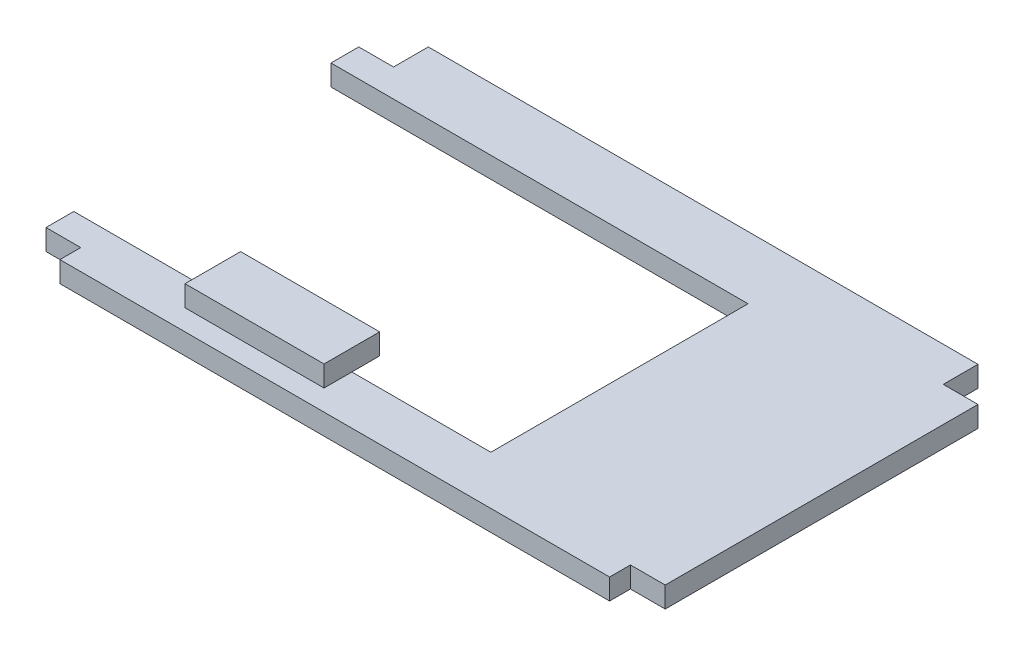
ISO-10303-21;
HEADER;
FILE_DESCRIPTION(('STEP AP214'),'2;1');
FILE_NAME('part.step','',(''),(''),'','','');
FILE_SCHEMA(('AUTOMOTIVE_DESIGN { 1 0 10303 214 1 1 1 1 }'));
ENDSEC;
DATA;
#1=APPLICATION_CONTEXT('core data for automotive mechanical design processes');
#2=APPLICATION_PROTOCOL_DEFINITION('international standard','automotive_design',2000,#1);
#3=PRODUCT_CONTEXT('',#1,'mechanical');
#4=PRODUCT('Part','Part','',(#3));
#5=PRODUCT_RELATED_PRODUCT_CATEGORY('part','',(#4));
#6=PRODUCT_DEFINITION_FORMATION('','',#4);
#7=PRODUCT_DEFINITION_CONTEXT('part definition',#1,'design');
#8=PRODUCT_DEFINITION('design','',#6,#7);
#9=PRODUCT_DEFINITION_SHAPE('','',#8);
#10=(LENGTH_UNIT() NAMED_UNIT(*) SI_UNIT(.MILLI.,.METRE.));
#11=(NAMED_UNIT(*) PLANE_ANGLE_UNIT() SI_UNIT($,.RADIAN.));
#12=(NAMED_UNIT(*) SI_UNIT($,.STERADIAN.) SOLID_ANGLE_UNIT());
#13=UNCERTAINTY_MEASURE_WITH_UNIT(LENGTH_MEASURE(1.E-05),#10,'distance_accuracy_value','');
#14=(GEOMETRIC_REPRESENTATION_CONTEXT(3) GLOBAL_UNCERTAINTY_ASSIGNED_CONTEXT((#13)) GLOBAL_UNIT_ASSIGNED_CONTEXT((#10,
#11,#12)) REPRESENTATION_CONTEXT('',''));
#15=CARTESIAN_POINT('',(0.,0.,0.));
#16=DIRECTION('',(0.,0.,1.));
#17=DIRECTION('',(1.,0.,0.));
#18=AXIS2_PLACEMENT_3D('',#15,#16,#17);
#19=CARTESIAN_POINT('',(75.,0.,0.));
#20=DIRECTION('',(1.,0.,0.));
#21=DIRECTION('',(0.,0.,1.));
#22=AXIS2_PLACEMENT_3D('',#19,#20,#21);
#23=PLANE('',#22);
#24=DIRECTION('',(0.,0.,1.));
#25=VECTOR('',#24,1.);
#26=CARTESIAN_POINT('',(75.,-81.,0.));
#27=LINE('',#26,#25);
#28=CARTESIAN_POINT('',(75.,-81.,41.));
#29=VERTEX_POINT('',#28);
#30=CARTESIAN_POINT('',(75.,-81.,45.));
#31=VERTEX_POINT('',#30);
#32=EDGE_CURVE('E256',#29,#31,#27,.T.);
#33=ORIENTED_EDGE('',*,*,#32,.F.);
#34=DIRECTION('',(0.,-1.,0.));
#35=VECTOR('',#34,1.);
#36=CARTESIAN_POINT('',(75.,0.,41.));
#37=LINE('',#36,#35);
#38=CARTESIAN_POINT('',(75.,-84.,41.));
#39=VERTEX_POINT('',#38);
#40=EDGE_CURVE('E41',#29,#39,#37,.T.);
#41=ORIENTED_EDGE('',*,*,#40,.T.);
#42=DIRECTION('',(0.,0.,-1.));
#43=VECTOR('',#42,1.);
#44=CARTESIAN_POINT('',(75.,-84.,0.));
#45=LINE('',#44,#43);
#46=CARTESIAN_POINT('',(75.,-84.,45.));
#47=VERTEX_POINT('',#46);
#48=EDGE_CURVE('E250',#47,#39,#45,.T.);
#49=ORIENTED_EDGE('',*,*,#48,.F.);
#50=DIRECTION('',(0.,-1.,0.));
#51=VECTOR('',#50,1.);
#52=CARTESIAN_POINT('',(75.,-81.,45.));
#53=LINE('',#52,#51);
#54=EDGE_CURVE('E253',#31,#47,#53,.T.);
#55=ORIENTED_EDGE('',*,*,#54,.F.);
#56=EDGE_LOOP('',(#33,#41,#49,#55));
#57=FACE_BOUND('',#56,.T.);
#58=ADVANCED_FACE('F37',(#57),#23,.F.);
#59=CARTESIAN_POINT('',(80.,-81.,127.141476844526));
#60=DIRECTION('',(1.,0.,0.));
#61=DIRECTION('',(0.,0.,-1.));
#62=AXIS2_PLACEMENT_3D('',#59,#60,#61);
#63=PLANE('',#62);
#64=DIRECTION('',(0.,0.,-1.));
#65=VECTOR('',#64,1.);
#66=CARTESIAN_POINT('',(80.,-84.,127.141476844526));
#67=LINE('',#66,#65);
#68=CARTESIAN_POINT('',(80.,-84.,0.));
#69=VERTEX_POINT('',#68);
#70=CARTESIAN_POINT('',(80.,-84.,-5.));
#71=VERTEX_POINT('',#70);
#72=EDGE_CURVE('E307',#69,#71,#67,.T.);
#73=ORIENTED_EDGE('',*,*,#72,.F.);
#74=DIRECTION('',(0.,1.,0.));
#75=VECTOR('',#74,1.);
#76=CARTESIAN_POINT('',(80.,-81.,0.));
#77=LINE('',#76,#75);
#78=CARTESIAN_POINT('',(80.,-81.,0.));
#79=VERTEX_POINT('',#78);
#80=EDGE_CURVE('E244',#69,#79,#77,.T.);
#81=ORIENTED_EDGE('',*,*,#80,.T.);
#82=DIRECTION('',(0.,0.,-1.));
#83=VECTOR('',#82,1.);
#84=CARTESIAN_POINT('',(80.,-81.,127.141476844526));
#85=LINE('',#84,#83);
#86=CARTESIAN_POINT('',(80.,-81.,-5.));
#87=VERTEX_POINT('',#86);
#88=EDGE_CURVE('E314',#79,#87,#85,.T.);
#89=ORIENTED_EDGE('',*,*,#88,.T.);
#90=DIRECTION('',(0.,1.,0.));
#91=VECTOR('',#90,1.);
#92=CARTESIAN_POINT('',(80.,-81.,-5.));
#93=LINE('',#92,#91);
#94=EDGE_CURVE('E348',#71,#87,#93,.T.);
#95=ORIENTED_EDGE('',*,*,#94,.F.);
#96=EDGE_LOOP('',(#73,#81,#89,#95));
#97=FACE_BOUND('',#96,.T.);
#98=ADVANCED_FACE('F361',(#97),#63,.F.);
#99=CARTESIAN_POINT('',(159.084596206421,-81.,127.141476844526));
#100=DIRECTION('',(-1.,0.,0.));
#101=DIRECTION('',(0.,0.,1.));
#102=AXIS2_PLACEMENT_3D('',#99,#100,#101);
#103=PLANE('',#102);
#104=DIRECTION('',(0.,1.,0.));
#105=VECTOR('',#104,1.);
#106=CARTESIAN_POINT('',(159.084596206421,-81.,0.));
#107=LINE('',#106,#105);
#108=CARTESIAN_POINT('',(159.084596206421,-84.,0.));
#109=VERTEX_POINT('',#108);
#110=CARTESIAN_POINT('',(159.084596206421,-81.,0.));
#111=VERTEX_POINT('',#110);
#112=EDGE_CURVE('E273',#109,#111,#107,.T.);
#113=ORIENTED_EDGE('',*,*,#112,.F.);
#114=DIRECTION('',(0.,0.,-1.));
#115=VECTOR('',#114,1.);
#116=CARTESIAN_POINT('',(159.084596206421,-84.,127.141476844526));
#117=LINE('',#116,#115);
#118=CARTESIAN_POINT('',(159.084596206421,-84.,-5.));
#119=VERTEX_POINT('',#118);
#120=EDGE_CURVE('E313',#109,#119,#117,.T.);
#121=ORIENTED_EDGE('',*,*,#120,.T.);
#122=DIRECTION('',(0.,-1.,0.));
#123=VECTOR('',#122,1.);
#124=CARTESIAN_POINT('',(159.084596206421,-81.,-5.));
#125=LINE('',#124,#123);
#126=CARTESIAN_POINT('',(159.084596206421,-81.,-5.));
#127=VERTEX_POINT('',#126);
#128=EDGE_CURVE('E342',#127,#119,#125,.T.);
#129=ORIENTED_EDGE('',*,*,#128,.F.);
#130=DIRECTION('',(0.,0.,-1.));
#131=VECTOR('',#130,1.);
#132=CARTESIAN_POINT('',(159.084596206421,-81.,127.141476844526));
#133=LINE('',#132,#131);
#134=EDGE_CURVE('E325',#111,#127,#133,.T.);
#135=ORIENTED_EDGE('',*,*,#134,.F.);
#136=EDGE_LOOP('',(#113,#121,#129,#135));
#137=FACE_BOUND('',#136,.T.);
#138=ADVANCED_FACE('F368',(#137),#103,.F.);
#139=DIRECTION('',(0.,-1.,0.));
#140=VECTOR('',#139,1.);
#141=CARTESIAN_POINT('',(159.084596206421,-81.,45.));
#142=LINE('',#141,#140);
#143=CARTESIAN_POINT('',(159.084596206421,-81.,45.));
#144=VERTEX_POINT('',#143);
#145=CARTESIAN_POINT('',(159.084596206421,-84.,45.));
#146=VERTEX_POINT('',#145);
#147=EDGE_CURVE('E330',#144,#146,#142,.T.);
#148=ORIENTED_EDGE('',*,*,#147,.F.);
#149=CARTESIAN_POINT('',(159.084596206421,-81.,48.));
#150=VERTEX_POINT('',#149);
#151=EDGE_CURVE('E300',#150,#144,#133,.T.);
#152=ORIENTED_EDGE('',*,*,#151,.F.);
#153=DIRECTION('',(0.,1.,0.));
#154=VECTOR('',#153,1.);
#155=CARTESIAN_POINT('',(159.084596206421,-81.,48.));
#156=LINE('',#155,#154);
#157=CARTESIAN_POINT('',(159.084596206421,-84.,48.));
#158=VERTEX_POINT('',#157);
#159=EDGE_CURVE('E277',#158,#150,#156,.T.);
#160=ORIENTED_EDGE('',*,*,#159,.F.);
#161=EDGE_CURVE('E322',#158,#146,#117,.T.);
#162=ORIENTED_EDGE('',*,*,#161,.T.);
#163=EDGE_LOOP('',(#148,#152,#160,#162));
#164=FACE_BOUND('',#163,.T.);
#165=ADVANCED_FACE('F403',(#164),#103,.F.);
#166=CARTESIAN_POINT('',(80.,-81.,48.));
#167=VERTEX_POINT('',#166);
#168=CARTESIAN_POINT('',(80.,-81.,45.));
#169=VERTEX_POINT('',#168);
#170=EDGE_CURVE('E317',#167,#169,#85,.T.);
#171=ORIENTED_EDGE('',*,*,#170,.T.);
#172=DIRECTION('',(0.,-1.,0.));
#173=VECTOR('',#172,1.);
#174=CARTESIAN_POINT('',(80.,-81.,45.));
#175=LINE('',#174,#173);
#176=CARTESIAN_POINT('',(80.,-84.,45.));
#177=VERTEX_POINT('',#176);
#178=EDGE_CURVE('E249',#169,#177,#175,.T.);
#179=ORIENTED_EDGE('',*,*,#178,.T.);
#180=CARTESIAN_POINT('',(80.,-84.,48.));
#181=VERTEX_POINT('',#180);
#182=EDGE_CURVE('E310',#181,#177,#67,.T.);
#183=ORIENTED_EDGE('',*,*,#182,.F.);
#184=DIRECTION('',(0.,-1.,0.));
#185=VECTOR('',#184,1.);
#186=CARTESIAN_POINT('',(80.,-81.,48.));
#187=LINE('',#186,#185);
#188=EDGE_CURVE('E289',#167,#181,#187,.T.);
#189=ORIENTED_EDGE('',*,*,#188,.F.);
#190=EDGE_LOOP('',(#171,#179,#183,#189));
#191=FACE_BOUND('',#190,.T.);
#192=ADVANCED_FACE('F409',(#191),#63,.F.);
#193=CARTESIAN_POINT('',(80.,-84.,127.141476844526));
#194=DIRECTION('',(0.,1.,0.));
#195=DIRECTION('',(0.,0.,1.));
#196=AXIS2_PLACEMENT_3D('',#193,#194,#195);
#197=PLANE('',#196);
#198=ORIENTED_EDGE('',*,*,#48,.T.);
#199=DIRECTION('',(1.,0.,0.));
#200=VECTOR('',#199,1.);
#201=CARTESIAN_POINT('',(80.,-84.,41.));
#202=LINE('',#201,#200);
#203=CARTESIAN_POINT('',(135.,-84.,41.));
#204=VERTEX_POINT('',#203);
#205=EDGE_CURVE('E238',#39,#204,#202,.T.);
#206=ORIENTED_EDGE('',*,*,#205,.T.);
#207=DIRECTION('',(0.,0.,-1.));
#208=VECTOR('',#207,1.);
#209=CARTESIAN_POINT('',(135.,-84.,127.141476844526));
#210=LINE('',#209,#208);
#211=CARTESIAN_POINT('',(135.,-84.,4.));
#212=VERTEX_POINT('',#211);
#213=EDGE_CURVE('E241',#204,#212,#210,.T.);
#214=ORIENTED_EDGE('',*,*,#213,.T.);
#215=DIRECTION('',(-1.,0.,0.));
#216=VECTOR('',#215,1.);
#217=CARTESIAN_POINT('',(80.,-84.,4.00000000000002));
#218=LINE('',#217,#216);
#219=CARTESIAN_POINT('',(75.,-84.,4.00000000000001));
#220=VERTEX_POINT('',#219);
#221=EDGE_CURVE('E234',#212,#220,#218,.T.);
#222=ORIENTED_EDGE('',*,*,#221,.T.);
#223=CARTESIAN_POINT('',(75.,-84.,0.));
#224=VERTEX_POINT('',#223);
#225=EDGE_CURVE('E248',#220,#224,#45,.T.);
#226=ORIENTED_EDGE('',*,*,#225,.T.);
#227=DIRECTION('',(1.,0.,0.));
#228=VECTOR('',#227,1.);
#229=CARTESIAN_POINT('',(75.,-84.,0.));
#230=LINE('',#229,#228);
#231=EDGE_CURVE('E271',#224,#69,#230,.T.);
#232=ORIENTED_EDGE('',*,*,#231,.T.);
#233=ORIENTED_EDGE('',*,*,#72,.T.);
#234=DIRECTION('',(-1.,0.,0.));
#235=VECTOR('',#234,1.);
#236=CARTESIAN_POINT('',(80.,-84.,-5.));
#237=LINE('',#236,#235);
#238=EDGE_CURVE('E292',#119,#71,#237,.T.);
#239=ORIENTED_EDGE('',*,*,#238,.F.);
#240=ORIENTED_EDGE('',*,*,#120,.F.);
#241=DIRECTION('',(-1.,0.,0.));
#242=VECTOR('',#241,1.);
#243=CARTESIAN_POINT('',(164.084596206421,-84.,0.));
#244=LINE('',#243,#242);
#245=CARTESIAN_POINT('',(164.084596206421,-84.,0.));
#246=VERTEX_POINT('',#245);
#247=EDGE_CURVE('E374',#246,#109,#244,.T.);
#248=ORIENTED_EDGE('',*,*,#247,.F.);
#249=DIRECTION('',(0.,0.,-1.));
#250=VECTOR('',#249,1.);
#251=CARTESIAN_POINT('',(164.084596206421,-84.,0.));
#252=LINE('',#251,#250);
#253=CARTESIAN_POINT('',(164.084596206421,-84.,45.));
#254=VERTEX_POINT('',#253);
#255=EDGE_CURVE('E380',#254,#246,#252,.T.);
#256=ORIENTED_EDGE('',*,*,#255,.F.);
#257=DIRECTION('',(-1.,0.,0.));
#258=VECTOR('',#257,1.);
#259=CARTESIAN_POINT('',(164.084596206421,-84.,45.));
#260=LINE('',#259,#258);
#261=EDGE_CURVE('E335',#254,#146,#260,.T.);
#262=ORIENTED_EDGE('',*,*,#261,.T.);
#263=ORIENTED_EDGE('',*,*,#161,.F.);
#264=DIRECTION('',(1.,0.,0.));
#265=VECTOR('',#264,1.);
#266=CARTESIAN_POINT('',(80.,-84.,48.));
#267=LINE('',#266,#265);
#268=EDGE_CURVE('E283',#181,#158,#267,.T.);
#269=ORIENTED_EDGE('',*,*,#268,.F.);
#270=ORIENTED_EDGE('',*,*,#182,.T.);
#271=DIRECTION('',(1.,0.,0.));
#272=VECTOR('',#271,1.);
#273=CARTESIAN_POINT('',(75.,-84.,45.));
#274=LINE('',#273,#272);
#275=EDGE_CURVE('E274',#47,#177,#274,.T.);
#276=ORIENTED_EDGE('',*,*,#275,.F.);
#277=EDGE_LOOP('',(#198,#206,#214,#222,#226,#232,#233,#239,#240,#248,#256,#262,#263,#269,#270,#276));
#278=FACE_BOUND('',#277,.T.);
#279=ADVANCED_FACE('F372',(#278),#197,.F.);
#280=CARTESIAN_POINT('',(80.,-81.,127.141476844526));
#281=DIRECTION('',(0.,-1.,0.));
#282=DIRECTION('',(0.,0.,-1.));
#283=AXIS2_PLACEMENT_3D('',#280,#281,#282);
#284=PLANE('',#283);
#285=DIRECTION('',(-1.,0.,0.));
#286=VECTOR('',#285,1.);
#287=CARTESIAN_POINT('',(95.,-81.,45.));
#288=LINE('',#287,#286);
#289=CARTESIAN_POINT('',(115.,-81.,45.));
#290=VERTEX_POINT('',#289);
#291=CARTESIAN_POINT('',(95.,-81.,45.));
#292=VERTEX_POINT('',#291);
#293=EDGE_CURVE('E206',#290,#292,#288,.T.);
#294=ORIENTED_EDGE('',*,*,#293,.T.);
#295=DIRECTION('',(0.,0.,-1.));
#296=VECTOR('',#295,1.);
#297=CARTESIAN_POINT('',(95.,-81.,37.));
#298=LINE('',#297,#296);
#299=CARTESIAN_POINT('',(95.,-81.,41.));
#300=VERTEX_POINT('',#299);
#301=EDGE_CURVE('E54',#292,#300,#298,.T.);
#302=ORIENTED_EDGE('',*,*,#301,.T.);
#303=DIRECTION('',(1.,0.,0.));
#304=VECTOR('',#303,1.);
#305=CARTESIAN_POINT('',(135.,-81.,41.));
#306=LINE('',#305,#304);
#307=EDGE_CURVE('E226',#29,#300,#306,.T.);
#308=ORIENTED_EDGE('',*,*,#307,.F.);
#309=ORIENTED_EDGE('',*,*,#32,.T.);
#310=DIRECTION('',(1.,0.,0.));
#311=VECTOR('',#310,1.);
#312=CARTESIAN_POINT('',(75.,-81.,45.));
#313=LINE('',#312,#311);
#314=EDGE_CURVE('E414',#31,#169,#313,.T.);
#315=ORIENTED_EDGE('',*,*,#314,.T.);
#316=ORIENTED_EDGE('',*,*,#170,.F.);
#317=DIRECTION('',(-1.,0.,0.));
#318=VECTOR('',#317,1.);
#319=CARTESIAN_POINT('',(80.,-81.,48.));
#320=LINE('',#319,#318);
#321=EDGE_CURVE('E297',#150,#167,#320,.T.);
#322=ORIENTED_EDGE('',*,*,#321,.F.);
#323=ORIENTED_EDGE('',*,*,#151,.T.);
#324=DIRECTION('',(-1.,0.,0.));
#325=VECTOR('',#324,1.);
#326=CARTESIAN_POINT('',(164.084596206421,-81.,45.));
#327=LINE('',#326,#325);
#328=CARTESIAN_POINT('',(164.084596206421,-81.,45.));
#329=VERTEX_POINT('',#328);
#330=EDGE_CURVE('E383',#329,#144,#327,.T.);
#331=ORIENTED_EDGE('',*,*,#330,.F.);
#332=DIRECTION('',(0.,0.,1.));
#333=VECTOR('',#332,1.);
#334=CARTESIAN_POINT('',(164.084596206421,-81.,0.));
#335=LINE('',#334,#333);
#336=CARTESIAN_POINT('',(164.084596206421,-81.,0.));
#337=VERTEX_POINT('',#336);
#338=EDGE_CURVE('E400',#337,#329,#335,.T.);
#339=ORIENTED_EDGE('',*,*,#338,.F.);
#340=DIRECTION('',(-1.,0.,0.));
#341=VECTOR('',#340,1.);
#342=CARTESIAN_POINT('',(164.084596206421,-81.,0.));
#343=LINE('',#342,#341);
#344=EDGE_CURVE('E346',#337,#111,#343,.T.);
#345=ORIENTED_EDGE('',*,*,#344,.T.);
#346=ORIENTED_EDGE('',*,*,#134,.T.);
#347=DIRECTION('',(1.,0.,0.));
#348=VECTOR('',#347,1.);
#349=CARTESIAN_POINT('',(80.,-81.,-5.));
#350=LINE('',#349,#348);
#351=EDGE_CURVE('E345',#87,#127,#350,.T.);
#352=ORIENTED_EDGE('',*,*,#351,.F.);
#353=ORIENTED_EDGE('',*,*,#88,.F.);
#354=DIRECTION('',(1.,0.,0.));
#355=VECTOR('',#354,1.);
#356=CARTESIAN_POINT('',(75.,-81.,0.));
#357=LINE('',#356,#355);
#358=CARTESIAN_POINT('',(75.,-81.,0.));
#359=VERTEX_POINT('',#358);
#360=EDGE_CURVE('E260',#359,#79,#357,.T.);
#361=ORIENTED_EDGE('',*,*,#360,.F.);
#362=CARTESIAN_POINT('',(75.,-81.,3.99999999999999));
#363=VERTEX_POINT('',#362);
#364=EDGE_CURVE('E257',#359,#363,#27,.T.);
#365=ORIENTED_EDGE('',*,*,#364,.T.);
#366=DIRECTION('',(-1.,0.,0.));
#367=VECTOR('',#366,1.);
#368=CARTESIAN_POINT('',(135.,-81.,4.));
#369=LINE('',#368,#367);
#370=CARTESIAN_POINT('',(135.,-81.,4.));
#371=VERTEX_POINT('',#370);
#372=EDGE_CURVE('E62',#371,#363,#369,.T.);
#373=ORIENTED_EDGE('',*,*,#372,.F.);
#374=DIRECTION('',(0.,0.,-1.));
#375=VECTOR('',#374,1.);
#376=CARTESIAN_POINT('',(135.,-81.,41.));
#377=LINE('',#376,#375);
#378=CARTESIAN_POINT('',(135.,-81.,41.));
#379=VERTEX_POINT('',#378);
#380=EDGE_CURVE('E218',#379,#371,#377,.T.);
#381=ORIENTED_EDGE('',*,*,#380,.F.);
#382=CARTESIAN_POINT('',(115.,-81.,41.));
#383=VERTEX_POINT('',#382);
#384=EDGE_CURVE('E225',#383,#379,#306,.T.);
#385=ORIENTED_EDGE('',*,*,#384,.F.);
#386=DIRECTION('',(0.,0.,1.));
#387=VECTOR('',#386,1.);
#388=CARTESIAN_POINT('',(115.,-81.,37.));
#389=LINE('',#388,#387);
#390=EDGE_CURVE('E11',#383,#290,#389,.T.);
#391=ORIENTED_EDGE('',*,*,#390,.T.);
#392=EDGE_LOOP('',(#294,#302,#308,#309,#315,#316,#322,#323,#331,#339,#345,#346,#352,#353,#361,
#365,#373,#381,#385,#391));
#393=FACE_BOUND('',#392,.T.);
#394=ADVANCED_FACE('F365',(#393),#284,.F.);
#395=CARTESIAN_POINT('',(0.,0.,48.));
#396=DIRECTION('',(0.,0.,1.));
#397=DIRECTION('',(0.,-1.,0.));
#398=AXIS2_PLACEMENT_3D('',#395,#396,#397);
#399=PLANE('',#398);
#400=ORIENTED_EDGE('',*,*,#321,.T.);
#401=ORIENTED_EDGE('',*,*,#188,.T.);
#402=ORIENTED_EDGE('',*,*,#268,.T.);
#403=ORIENTED_EDGE('',*,*,#159,.T.);
#404=EDGE_LOOP('',(#400,#401,#402,#403));
#405=FACE_BOUND('',#404,.T.);
#406=ADVANCED_FACE('F39',(#405),#399,.T.);
#407=CARTESIAN_POINT('',(0.,0.,-5.));
#408=DIRECTION('',(0.,0.,1.));
#409=DIRECTION('',(0.,-1.,0.));
#410=AXIS2_PLACEMENT_3D('',#407,#408,#409);
#411=PLANE('',#410);
#412=ORIENTED_EDGE('',*,*,#94,.T.);
#413=ORIENTED_EDGE('',*,*,#351,.T.);
#414=ORIENTED_EDGE('',*,*,#128,.T.);
#415=ORIENTED_EDGE('',*,*,#238,.T.);
#416=EDGE_LOOP('',(#412,#413,#414,#415));
#417=FACE_BOUND('',#416,.T.);
#418=ADVANCED_FACE('F355',(#417),#411,.F.);
#419=CARTESIAN_POINT('',(164.084596206421,-81.,0.));
#420=DIRECTION('',(0.,0.,1.));
#421=DIRECTION('',(0.,-1.,0.));
#422=AXIS2_PLACEMENT_3D('',#419,#420,#421);
#423=PLANE('',#422);
#424=ORIENTED_EDGE('',*,*,#112,.T.);
#425=ORIENTED_EDGE('',*,*,#344,.F.);
#426=DIRECTION('',(0.,1.,0.));
#427=VECTOR('',#426,1.);
#428=CARTESIAN_POINT('',(164.084596206421,-81.,0.));
#429=LINE('',#428,#427);
#430=EDGE_CURVE('E334',#246,#337,#429,.T.);
#431=ORIENTED_EDGE('',*,*,#430,.F.);
#432=ORIENTED_EDGE('',*,*,#247,.T.);
#433=EDGE_LOOP('',(#424,#425,#431,#432));
#434=FACE_BOUND('',#433,.T.);
#435=ADVANCED_FACE('F377',(#434),#423,.F.);
#436=CARTESIAN_POINT('',(164.084596206421,-81.,45.));
#437=DIRECTION('',(0.,0.,-1.));
#438=DIRECTION('',(-1.,0.,0.));
#439=AXIS2_PLACEMENT_3D('',#436,#437,#438);
#440=PLANE('',#439);
#441=ORIENTED_EDGE('',*,*,#147,.T.);
#442=ORIENTED_EDGE('',*,*,#261,.F.);
#443=DIRECTION('',(0.,-1.,0.));
#444=VECTOR('',#443,1.);
#445=CARTESIAN_POINT('',(164.084596206421,-81.,45.));
#446=LINE('',#445,#444);
#447=EDGE_CURVE('E384',#329,#254,#446,.T.);
#448=ORIENTED_EDGE('',*,*,#447,.F.);
#449=ORIENTED_EDGE('',*,*,#330,.T.);
#450=EDGE_LOOP('',(#441,#442,#448,#449));
#451=FACE_BOUND('',#450,.T.);
#452=ADVANCED_FACE('F398',(#451),#440,.F.);
#453=CARTESIAN_POINT('',(164.084596206421,0.,0.));
#454=DIRECTION('',(-1.,0.,0.));
#455=DIRECTION('',(0.,0.,1.));
#456=AXIS2_PLACEMENT_3D('',#453,#454,#455);
#457=PLANE('',#456);
#458=ORIENTED_EDGE('',*,*,#430,.T.);
#459=ORIENTED_EDGE('',*,*,#338,.T.);
#460=ORIENTED_EDGE('',*,*,#447,.T.);
#461=ORIENTED_EDGE('',*,*,#255,.T.);
#462=EDGE_LOOP('',(#458,#459,#460,#461));
#463=FACE_BOUND('',#462,.T.);
#464=ADVANCED_FACE('F465',(#463),#457,.F.);
#465=CARTESIAN_POINT('',(75.,-81.,0.));
#466=DIRECTION('',(0.,0.,-1.));
#467=DIRECTION('',(0.,1.,0.));
#468=AXIS2_PLACEMENT_3D('',#465,#466,#467);
#469=PLANE('',#468);
#470=ORIENTED_EDGE('',*,*,#80,.F.);
#471=ORIENTED_EDGE('',*,*,#231,.F.);
#472=DIRECTION('',(0.,1.,0.));
#473=VECTOR('',#472,1.);
#474=CARTESIAN_POINT('',(75.,-81.,0.));
#475=LINE('',#474,#473);
#476=EDGE_CURVE('E245',#224,#359,#475,.T.);
#477=ORIENTED_EDGE('',*,*,#476,.T.);
#478=ORIENTED_EDGE('',*,*,#360,.T.);
#479=EDGE_LOOP('',(#470,#471,#477,#478));
#480=FACE_BOUND('',#479,.T.);
#481=ADVANCED_FACE('F427',(#480),#469,.T.);
#482=CARTESIAN_POINT('',(75.,-81.,45.));
#483=DIRECTION('',(0.,0.,1.));
#484=DIRECTION('',(1.,0.,0.));
#485=AXIS2_PLACEMENT_3D('',#482,#483,#484);
#486=PLANE('',#485);
#487=ORIENTED_EDGE('',*,*,#178,.F.);
#488=ORIENTED_EDGE('',*,*,#314,.F.);
#489=ORIENTED_EDGE('',*,*,#54,.T.);
#490=ORIENTED_EDGE('',*,*,#275,.T.);
#491=EDGE_LOOP('',(#487,#488,#489,#490));
#492=FACE_BOUND('',#491,.T.);
#493=ADVANCED_FACE('F420',(#492),#486,.T.);
#494=ORIENTED_EDGE('',*,*,#225,.F.);
#495=DIRECTION('',(0.,1.,0.));
#496=VECTOR('',#495,1.);
#497=CARTESIAN_POINT('',(75.,0.,4.00000000000001));
#498=LINE('',#497,#496);
#499=EDGE_CURVE('E276',#220,#363,#498,.T.);
#500=ORIENTED_EDGE('',*,*,#499,.T.);
#501=ORIENTED_EDGE('',*,*,#364,.F.);
#502=ORIENTED_EDGE('',*,*,#476,.F.);
#503=EDGE_LOOP('',(#494,#500,#501,#502));
#504=FACE_BOUND('',#503,.T.);
#505=ADVANCED_FACE('F430',(#504),#23,.F.);
#506=CARTESIAN_POINT('',(135.,-91.,41.));
#507=DIRECTION('',(1.,0.,0.));
#508=DIRECTION('',(0.,0.,-1.));
#509=AXIS2_PLACEMENT_3D('',#506,#507,#508);
#510=PLANE('',#509);
#511=DIRECTION('',(0.,1.,0.));
#512=VECTOR('',#511,1.);
#513=CARTESIAN_POINT('',(135.,-91.,41.));
#514=LINE('',#513,#512);
#515=EDGE_CURVE('E231',#204,#379,#514,.T.);
#516=ORIENTED_EDGE('',*,*,#515,.T.);
#517=ORIENTED_EDGE('',*,*,#380,.T.);
#518=DIRECTION('',(0.,1.,0.));
#519=VECTOR('',#518,1.);
#520=CARTESIAN_POINT('',(135.,-91.,4.));
#521=LINE('',#520,#519);
#522=EDGE_CURVE('E229',#212,#371,#521,.T.);
#523=ORIENTED_EDGE('',*,*,#522,.F.);
#524=ORIENTED_EDGE('',*,*,#213,.F.);
#525=EDGE_LOOP('',(#516,#517,#523,#524));
#526=FACE_BOUND('',#525,.T.);
#527=ADVANCED_FACE('F436',(#526),#510,.F.);
#528=CARTESIAN_POINT('',(135.,-91.,41.));
#529=DIRECTION('',(0.,0.,1.));
#530=DIRECTION('',(1.,0.,0.));
#531=AXIS2_PLACEMENT_3D('',#528,#529,#530);
#532=PLANE('',#531);
#533=ORIENTED_EDGE('',*,*,#40,.F.);
#534=ORIENTED_EDGE('',*,*,#307,.T.);
#535=EDGE_CURVE('E230',#300,#383,#306,.T.);
#536=ORIENTED_EDGE('',*,*,#535,.T.);
#537=ORIENTED_EDGE('',*,*,#384,.T.);
#538=ORIENTED_EDGE('',*,*,#515,.F.);
#539=ORIENTED_EDGE('',*,*,#205,.F.);
#540=EDGE_LOOP('',(#533,#534,#536,#537,#538,#539));
#541=FACE_BOUND('',#540,.T.);
#542=ADVANCED_FACE('F439',(#541),#532,.F.);
#543=CARTESIAN_POINT('',(135.,-91.,4.));
#544=DIRECTION('',(0.,0.,-1.));
#545=DIRECTION('',(-1.,0.,0.));
#546=AXIS2_PLACEMENT_3D('',#543,#544,#545);
#547=PLANE('',#546);
#548=ORIENTED_EDGE('',*,*,#522,.T.);
#549=ORIENTED_EDGE('',*,*,#372,.T.);
#550=ORIENTED_EDGE('',*,*,#499,.F.);
#551=ORIENTED_EDGE('',*,*,#221,.F.);
#552=EDGE_LOOP('',(#548,#549,#550,#551));
#553=FACE_BOUND('',#552,.T.);
#554=ADVANCED_FACE('F440',(#553),#547,.F.);
#555=CARTESIAN_POINT('',(95.,-78.,37.));
#556=DIRECTION('',(-1.,0.,0.));
#557=DIRECTION('',(0.,0.,1.));
#558=AXIS2_PLACEMENT_3D('',#555,#556,#557);
#559=PLANE('',#558);
#560=ORIENTED_EDGE('',*,*,#301,.F.);
#561=DIRECTION('',(0.,-1.,0.));
#562=VECTOR('',#561,1.);
#563=CARTESIAN_POINT('',(95.,-78.,45.));
#564=LINE('',#563,#562);
#565=CARTESIAN_POINT('',(95.,-78.,45.));
#566=VERTEX_POINT('',#565);
#567=EDGE_CURVE('E205',#566,#292,#564,.T.);
#568=ORIENTED_EDGE('',*,*,#567,.F.);
#569=DIRECTION('',(0.,0.,-1.));
#570=VECTOR('',#569,1.);
#571=CARTESIAN_POINT('',(95.,-78.,37.));
#572=LINE('',#571,#570);
#573=CARTESIAN_POINT('',(95.,-78.,37.));
#574=VERTEX_POINT('',#573);
#575=EDGE_CURVE('E199',#566,#574,#572,.T.);
#576=ORIENTED_EDGE('',*,*,#575,.T.);
#577=DIRECTION('',(0.,-1.,0.));
#578=VECTOR('',#577,1.);
#579=CARTESIAN_POINT('',(95.,-78.,37.));
#580=LINE('',#579,#578);
#581=CARTESIAN_POINT('',(95.,-81.,37.));
#582=VERTEX_POINT('',#581);
#583=EDGE_CURVE('E184',#574,#582,#580,.T.);
#584=ORIENTED_EDGE('',*,*,#583,.T.);
#585=EDGE_CURVE('E214',#300,#582,#298,.T.);
#586=ORIENTED_EDGE('',*,*,#585,.F.);
#587=EDGE_LOOP('',(#560,#568,#576,#584,#586));
#588=FACE_BOUND('',#587,.T.);
#589=ADVANCED_FACE('F204',(#588),#559,.T.);
#590=CARTESIAN_POINT('',(95.,-78.,45.));
#591=DIRECTION('',(0.,0.,1.));
#592=DIRECTION('',(1.,0.,0.));
#593=AXIS2_PLACEMENT_3D('',#590,#591,#592);
#594=PLANE('',#593);
#595=ORIENTED_EDGE('',*,*,#293,.F.);
#596=DIRECTION('',(0.,-1.,0.));
#597=VECTOR('',#596,1.);
#598=CARTESIAN_POINT('',(115.,-78.,45.));
#599=LINE('',#598,#597);
#600=CARTESIAN_POINT('',(115.,-78.,45.));
#601=VERTEX_POINT('',#600);
#602=EDGE_CURVE('E219',#601,#290,#599,.T.);
#603=ORIENTED_EDGE('',*,*,#602,.F.);
#604=DIRECTION('',(-1.,0.,0.));
#605=VECTOR('',#604,1.);
#606=CARTESIAN_POINT('',(95.,-78.,45.));
#607=LINE('',#606,#605);
#608=EDGE_CURVE('E192',#601,#566,#607,.T.);
#609=ORIENTED_EDGE('',*,*,#608,.T.);
#610=ORIENTED_EDGE('',*,*,#567,.T.);
#611=EDGE_LOOP('',(#595,#603,#609,#610));
#612=FACE_BOUND('',#611,.T.);
#613=ADVANCED_FACE('F447',(#612),#594,.T.);
#614=CARTESIAN_POINT('',(115.,-78.,37.));
#615=DIRECTION('',(1.,0.,0.));
#616=DIRECTION('',(0.,0.,-1.));
#617=AXIS2_PLACEMENT_3D('',#614,#615,#616);
#618=PLANE('',#617);
#619=CARTESIAN_POINT('',(115.,-81.,37.));
#620=VERTEX_POINT('',#619);
#621=EDGE_CURVE('E47',#620,#383,#389,.T.);
#622=ORIENTED_EDGE('',*,*,#621,.F.);
#623=DIRECTION('',(0.,-1.,0.));
#624=VECTOR('',#623,1.);
#625=CARTESIAN_POINT('',(115.,-78.,37.));
#626=LINE('',#625,#624);
#627=CARTESIAN_POINT('',(115.,-78.,37.));
#628=VERTEX_POINT('',#627);
#629=EDGE_CURVE('E191',#628,#620,#626,.T.);
#630=ORIENTED_EDGE('',*,*,#629,.F.);
#631=DIRECTION('',(0.,0.,1.));
#632=VECTOR('',#631,1.);
#633=CARTESIAN_POINT('',(115.,-78.,37.));
#634=LINE('',#633,#632);
#635=EDGE_CURVE('E202',#628,#601,#634,.T.);
#636=ORIENTED_EDGE('',*,*,#635,.T.);
#637=ORIENTED_EDGE('',*,*,#602,.T.);
#638=ORIENTED_EDGE('',*,*,#390,.F.);
#639=EDGE_LOOP('',(#622,#630,#636,#637,#638));
#640=FACE_BOUND('',#639,.T.);
#641=ADVANCED_FACE('F570',(#640),#618,.T.);
#642=CARTESIAN_POINT('',(95.,-78.,37.));
#643=DIRECTION('',(0.,0.,-1.));
#644=DIRECTION('',(-1.,0.,0.));
#645=AXIS2_PLACEMENT_3D('',#642,#643,#644);
#646=PLANE('',#645);
#647=DIRECTION('',(1.,0.,0.));
#648=VECTOR('',#647,1.);
#649=CARTESIAN_POINT('',(95.,-81.,37.));
#650=LINE('',#649,#648);
#651=EDGE_CURVE('E189',#582,#620,#650,.T.);
#652=ORIENTED_EDGE('',*,*,#651,.F.);
#653=ORIENTED_EDGE('',*,*,#583,.F.);
#654=DIRECTION('',(1.,0.,0.));
#655=VECTOR('',#654,1.);
#656=CARTESIAN_POINT('',(95.,-78.,37.));
#657=LINE('',#656,#655);
#658=EDGE_CURVE('E187',#574,#628,#657,.T.);
#659=ORIENTED_EDGE('',*,*,#658,.T.);
#660=ORIENTED_EDGE('',*,*,#629,.T.);
#661=EDGE_LOOP('',(#652,#653,#659,#660));
#662=FACE_BOUND('',#661,.T.);
#663=ADVANCED_FACE('F186',(#662),#646,.T.);
#664=CARTESIAN_POINT('',(0.,-78.,0.));
#665=DIRECTION('',(0.,1.,0.));
#666=DIRECTION('',(0.,0.,1.));
#667=AXIS2_PLACEMENT_3D('',#664,#665,#666);
#668=PLANE('',#667);
#669=ORIENTED_EDGE('',*,*,#575,.F.);
#670=ORIENTED_EDGE('',*,*,#608,.F.);
#671=ORIENTED_EDGE('',*,*,#635,.F.);
#672=ORIENTED_EDGE('',*,*,#658,.F.);
#673=EDGE_LOOP('',(#669,#670,#671,#672));
#674=FACE_BOUND('',#673,.T.);
#675=ADVANCED_FACE('F197',(#674),#668,.T.);
#676=CARTESIAN_POINT('',(0.,-81.,0.));
#677=DIRECTION('',(0.,1.,0.));
#678=DIRECTION('',(0.,0.,1.));
#679=AXIS2_PLACEMENT_3D('',#676,#677,#678);
#680=PLANE('',#679);
#681=ORIENTED_EDGE('',*,*,#535,.F.);
#682=ORIENTED_EDGE('',*,*,#585,.T.);
#683=ORIENTED_EDGE('',*,*,#651,.T.);
#684=ORIENTED_EDGE('',*,*,#621,.T.);
#685=EDGE_LOOP('',(#681,#682,#683,#684));
#686=FACE_BOUND('',#685,.T.);
#687=ADVANCED_FACE('F597',(#686),#680,.F.);
#688=CLOSED_SHELL('',(#58,#98,#138,#165,#192,#279,#394,#406,#418,#435,#452,#464,#481,#493,#505,
#527,#542,#554,#589,#613,#641,#663,#675,#687));
#689=MANIFOLD_SOLID_BREP('B2',#688);
#690=ADVANCED_BREP_SHAPE_REPRESENTATION('',(#18,#689),#14);
#691=SHAPE_DEFINITION_REPRESENTATION(#9,#690);
ENDSEC;
END-ISO-10303-21;
